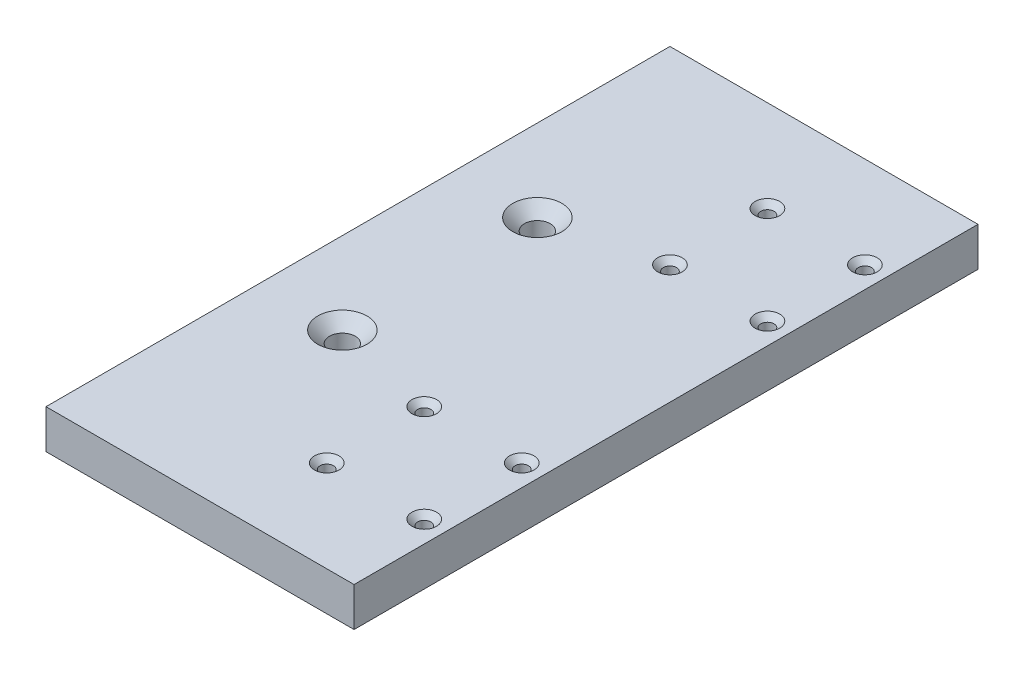
ISO-10303-21;
HEADER;
FILE_DESCRIPTION(('STEP AP214'),'2;1');
FILE_NAME('part.step','',(''),(''),'','','');
FILE_SCHEMA(('AUTOMOTIVE_DESIGN { 1 0 10303 214 1 1 1 1 }'));
ENDSEC;
DATA;
#1=APPLICATION_CONTEXT('core data for automotive mechanical design processes');
#2=APPLICATION_PROTOCOL_DEFINITION('international standard','automotive_design',2000,#1);
#3=PRODUCT_CONTEXT('',#1,'mechanical');
#4=PRODUCT('Part','Part','',(#3));
#5=PRODUCT_RELATED_PRODUCT_CATEGORY('part','',(#4));
#6=PRODUCT_DEFINITION_FORMATION('','',#4);
#7=PRODUCT_DEFINITION_CONTEXT('part definition',#1,'design');
#8=PRODUCT_DEFINITION('design','',#6,#7);
#9=PRODUCT_DEFINITION_SHAPE('','',#8);
#10=(LENGTH_UNIT() NAMED_UNIT(*) SI_UNIT(.MILLI.,.METRE.));
#11=(NAMED_UNIT(*) PLANE_ANGLE_UNIT() SI_UNIT($,.RADIAN.));
#12=(NAMED_UNIT(*) SI_UNIT($,.STERADIAN.) SOLID_ANGLE_UNIT());
#13=UNCERTAINTY_MEASURE_WITH_UNIT(LENGTH_MEASURE(1.E-05),#10,'distance_accuracy_value','');
#14=(GEOMETRIC_REPRESENTATION_CONTEXT(3) GLOBAL_UNCERTAINTY_ASSIGNED_CONTEXT((#13)) GLOBAL_UNIT_ASSIGNED_CONTEXT((#10,
#11,#12)) REPRESENTATION_CONTEXT('',''));
#15=CARTESIAN_POINT('',(0.,0.,0.));
#16=DIRECTION('',(0.,0.,1.));
#17=DIRECTION('',(1.,0.,0.));
#18=AXIS2_PLACEMENT_3D('',#15,#16,#17);
#19=CARTESIAN_POINT('',(39.5,10.,-80.));
#20=DIRECTION('',(-1.,0.,0.));
#21=DIRECTION('',(0.,0.,1.));
#22=AXIS2_PLACEMENT_3D('',#19,#20,#21);
#23=PLANE('',#22);
#24=DIRECTION('',(0.,0.,-1.));
#25=VECTOR('',#24,1.);
#26=CARTESIAN_POINT('',(39.5,0.,-80.));
#27=LINE('',#26,#25);
#28=CARTESIAN_POINT('',(39.5,0.,80.));
#29=VERTEX_POINT('',#28);
#30=CARTESIAN_POINT('',(39.5,0.,-80.));
#31=VERTEX_POINT('',#30);
#32=EDGE_CURVE('E249',#29,#31,#27,.T.);
#33=ORIENTED_EDGE('',*,*,#32,.T.);
#34=DIRECTION('',(0.,-1.,0.));
#35=VECTOR('',#34,1.);
#36=CARTESIAN_POINT('',(39.5,10.,-80.));
#37=LINE('',#36,#35);
#38=CARTESIAN_POINT('',(39.5,10.,-80.));
#39=VERTEX_POINT('',#38);
#40=EDGE_CURVE('E11',#39,#31,#37,.T.);
#41=ORIENTED_EDGE('',*,*,#40,.F.);
#42=DIRECTION('',(0.,0.,-1.));
#43=VECTOR('',#42,1.);
#44=CARTESIAN_POINT('',(39.5,10.,-80.));
#45=LINE('',#44,#43);
#46=CARTESIAN_POINT('',(39.5,10.,80.));
#47=VERTEX_POINT('',#46);
#48=EDGE_CURVE('E250',#47,#39,#45,.T.);
#49=ORIENTED_EDGE('',*,*,#48,.F.);
#50=DIRECTION('',(0.,-1.,0.));
#51=VECTOR('',#50,1.);
#52=CARTESIAN_POINT('',(39.5,10.,80.));
#53=LINE('',#52,#51);
#54=EDGE_CURVE('E260',#47,#29,#53,.T.);
#55=ORIENTED_EDGE('',*,*,#54,.T.);
#56=EDGE_LOOP('',(#33,#41,#49,#55));
#57=FACE_BOUND('',#56,.T.);
#58=ADVANCED_FACE('F43',(#57),#23,.F.);
#59=CARTESIAN_POINT('',(-39.5,10.,-80.));
#60=DIRECTION('',(0.,0.,1.));
#61=DIRECTION('',(1.,0.,0.));
#62=AXIS2_PLACEMENT_3D('',#59,#60,#61);
#63=PLANE('',#62);
#64=DIRECTION('',(-1.,0.,0.));
#65=VECTOR('',#64,1.);
#66=CARTESIAN_POINT('',(-39.5,0.,-80.));
#67=LINE('',#66,#65);
#68=CARTESIAN_POINT('',(-39.5,0.,-80.));
#69=VERTEX_POINT('',#68);
#70=EDGE_CURVE('E264',#31,#69,#67,.T.);
#71=ORIENTED_EDGE('',*,*,#70,.T.);
#72=DIRECTION('',(0.,-1.,0.));
#73=VECTOR('',#72,1.);
#74=CARTESIAN_POINT('',(-39.5,10.,-80.));
#75=LINE('',#74,#73);
#76=CARTESIAN_POINT('',(-39.5,10.,-80.));
#77=VERTEX_POINT('',#76);
#78=EDGE_CURVE('E52',#77,#69,#75,.T.);
#79=ORIENTED_EDGE('',*,*,#78,.F.);
#80=DIRECTION('',(-1.,0.,0.));
#81=VECTOR('',#80,1.);
#82=CARTESIAN_POINT('',(-39.5,10.,-80.));
#83=LINE('',#82,#81);
#84=EDGE_CURVE('E91',#39,#77,#83,.T.);
#85=ORIENTED_EDGE('',*,*,#84,.F.);
#86=ORIENTED_EDGE('',*,*,#40,.T.);
#87=EDGE_LOOP('',(#71,#79,#85,#86));
#88=FACE_BOUND('',#87,.T.);
#89=ADVANCED_FACE('F294',(#88),#63,.F.);
#90=CARTESIAN_POINT('',(-39.5,10.,-80.));
#91=DIRECTION('',(1.,0.,0.));
#92=DIRECTION('',(0.,0.,-1.));
#93=AXIS2_PLACEMENT_3D('',#90,#91,#92);
#94=PLANE('',#93);
#95=CARTESIAN_POINT('',(-39.5,5.,-40.));
#96=DIRECTION('',(-1.,0.,0.));
#97=DIRECTION('',(0.,0.,1.));
#98=AXIS2_PLACEMENT_3D('',#95,#96,#97);
#99=CIRCLE('',#98,3.025);
#100=CARTESIAN_POINT('',(-39.5,5.,-36.975));
#101=VERTEX_POINT('',#100);
#102=EDGE_CURVE('E118',#101,#101,#99,.T.);
#103=ORIENTED_EDGE('',*,*,#102,.F.);
#104=EDGE_LOOP('',(#103));
#105=FACE_BOUND('',#104,.T.);
#106=CARTESIAN_POINT('',(-39.5,5.,40.));
#107=DIRECTION('',(-1.,0.,0.));
#108=DIRECTION('',(0.,0.,1.));
#109=AXIS2_PLACEMENT_3D('',#106,#107,#108);
#110=CIRCLE('',#109,3.025);
#111=CARTESIAN_POINT('',(-39.5,5.,43.025));
#112=VERTEX_POINT('',#111);
#113=EDGE_CURVE('E109',#112,#112,#110,.T.);
#114=ORIENTED_EDGE('',*,*,#113,.F.);
#115=EDGE_LOOP('',(#114));
#116=FACE_BOUND('',#115,.T.);
#117=DIRECTION('',(0.,0.,1.));
#118=VECTOR('',#117,1.);
#119=CARTESIAN_POINT('',(-39.5,0.,-80.));
#120=LINE('',#119,#118);
#121=CARTESIAN_POINT('',(-39.5,0.,80.));
#122=VERTEX_POINT('',#121);
#123=EDGE_CURVE('E78',#69,#122,#120,.T.);
#124=ORIENTED_EDGE('',*,*,#123,.T.);
#125=DIRECTION('',(0.,-1.,0.));
#126=VECTOR('',#125,1.);
#127=CARTESIAN_POINT('',(-39.5,10.,80.));
#128=LINE('',#127,#126);
#129=CARTESIAN_POINT('',(-39.5,10.,80.));
#130=VERTEX_POINT('',#129);
#131=EDGE_CURVE('E273',#130,#122,#128,.T.);
#132=ORIENTED_EDGE('',*,*,#131,.F.);
#133=DIRECTION('',(0.,0.,1.));
#134=VECTOR('',#133,1.);
#135=CARTESIAN_POINT('',(-39.5,10.,-80.));
#136=LINE('',#135,#134);
#137=EDGE_CURVE('E255',#77,#130,#136,.T.);
#138=ORIENTED_EDGE('',*,*,#137,.F.);
#139=ORIENTED_EDGE('',*,*,#78,.T.);
#140=EDGE_LOOP('',(#124,#132,#138,#139));
#141=FACE_BOUND('',#140,.T.);
#142=ADVANCED_FACE('F277',(#105,#116,#141),#94,.F.);
#143=CARTESIAN_POINT('',(-39.5,10.,80.));
#144=DIRECTION('',(0.,0.,-1.));
#145=DIRECTION('',(-1.,0.,0.));
#146=AXIS2_PLACEMENT_3D('',#143,#144,#145);
#147=PLANE('',#146);
#148=DIRECTION('',(1.,0.,0.));
#149=VECTOR('',#148,1.);
#150=CARTESIAN_POINT('',(-39.5,0.,80.));
#151=LINE('',#150,#149);
#152=EDGE_CURVE('E84',#122,#29,#151,.T.);
#153=ORIENTED_EDGE('',*,*,#152,.T.);
#154=ORIENTED_EDGE('',*,*,#54,.F.);
#155=DIRECTION('',(1.,0.,0.));
#156=VECTOR('',#155,1.);
#157=CARTESIAN_POINT('',(-39.5,10.,80.));
#158=LINE('',#157,#156);
#159=EDGE_CURVE('E60',#130,#47,#158,.T.);
#160=ORIENTED_EDGE('',*,*,#159,.F.);
#161=ORIENTED_EDGE('',*,*,#131,.T.);
#162=EDGE_LOOP('',(#153,#154,#160,#161));
#163=FACE_BOUND('',#162,.T.);
#164=ADVANCED_FACE('F284',(#163),#147,.F.);
#165=CARTESIAN_POINT('',(0.,10.,0.));
#166=DIRECTION('',(0.,1.,0.));
#167=DIRECTION('',(0.,0.,1.));
#168=AXIS2_PLACEMENT_3D('',#165,#166,#167);
#169=PLANE('',#168);
#170=CARTESIAN_POINT('',(-18.5,10.,-25.));
#171=DIRECTION('',(0.,1.,0.));
#172=DIRECTION('',(0.,0.,1.));
#173=AXIS2_PLACEMENT_3D('',#170,#171,#172);
#174=CIRCLE('',#173,6.3);
#175=CARTESIAN_POINT('',(-18.5,10.,-18.7));
#176=VERTEX_POINT('',#175);
#177=EDGE_CURVE('E129',#176,#176,#174,.T.);
#178=ORIENTED_EDGE('',*,*,#177,.F.);
#179=EDGE_LOOP('',(#178));
#180=FACE_BOUND('',#179,.T.);
#181=CARTESIAN_POINT('',(-18.5,10.,25.));
#182=DIRECTION('',(0.,1.,0.));
#183=DIRECTION('',(0.,0.,1.));
#184=AXIS2_PLACEMENT_3D('',#181,#182,#183);
#185=CIRCLE('',#184,6.3);
#186=CARTESIAN_POINT('',(-18.5,10.,31.3));
#187=VERTEX_POINT('',#186);
#188=EDGE_CURVE('E141',#187,#187,#185,.T.);
#189=ORIENTED_EDGE('',*,*,#188,.F.);
#190=EDGE_LOOP('',(#189));
#191=FACE_BOUND('',#190,.T.);
#192=CARTESIAN_POINT('',(9.00000000000001,10.,56.5));
#193=DIRECTION('',(0.,1.,0.));
#194=DIRECTION('',(0.,0.,1.));
#195=AXIS2_PLACEMENT_3D('',#192,#193,#194);
#196=CIRCLE('',#195,3.15);
#197=CARTESIAN_POINT('',(9.00000000000001,10.,59.65));
#198=VERTEX_POINT('',#197);
#199=EDGE_CURVE('E153',#198,#198,#196,.T.);
#200=ORIENTED_EDGE('',*,*,#199,.F.);
#201=EDGE_LOOP('',(#200));
#202=FACE_BOUND('',#201,.T.);
#203=CARTESIAN_POINT('',(34.,10.,56.5));
#204=DIRECTION('',(0.,1.,0.));
#205=DIRECTION('',(0.,0.,1.));
#206=AXIS2_PLACEMENT_3D('',#203,#204,#205);
#207=CIRCLE('',#206,3.15);
#208=CARTESIAN_POINT('',(34.,10.,59.65));
#209=VERTEX_POINT('',#208);
#210=EDGE_CURVE('E165',#209,#209,#207,.T.);
#211=ORIENTED_EDGE('',*,*,#210,.F.);
#212=EDGE_LOOP('',(#211));
#213=FACE_BOUND('',#212,.T.);
#214=CARTESIAN_POINT('',(34.,10.,31.5));
#215=DIRECTION('',(0.,1.,0.));
#216=DIRECTION('',(0.,0.,1.));
#217=AXIS2_PLACEMENT_3D('',#214,#215,#216);
#218=CIRCLE('',#217,3.15);
#219=CARTESIAN_POINT('',(34.,10.,34.65));
#220=VERTEX_POINT('',#219);
#221=EDGE_CURVE('E177',#220,#220,#218,.T.);
#222=ORIENTED_EDGE('',*,*,#221,.F.);
#223=EDGE_LOOP('',(#222));
#224=FACE_BOUND('',#223,.T.);
#225=CARTESIAN_POINT('',(9.00000000000001,10.,31.5));
#226=DIRECTION('',(0.,1.,0.));
#227=DIRECTION('',(0.,0.,1.));
#228=AXIS2_PLACEMENT_3D('',#225,#226,#227);
#229=CIRCLE('',#228,3.15);
#230=CARTESIAN_POINT('',(9.00000000000001,10.,34.65));
#231=VERTEX_POINT('',#230);
#232=EDGE_CURVE('E189',#231,#231,#229,.T.);
#233=ORIENTED_EDGE('',*,*,#232,.F.);
#234=EDGE_LOOP('',(#233));
#235=FACE_BOUND('',#234,.T.);
#236=CARTESIAN_POINT('',(9.00000000000001,10.,-31.5));
#237=DIRECTION('',(0.,1.,0.));
#238=DIRECTION('',(0.,0.,1.));
#239=AXIS2_PLACEMENT_3D('',#236,#237,#238);
#240=CIRCLE('',#239,3.15);
#241=CARTESIAN_POINT('',(9.00000000000001,10.,-28.35));
#242=VERTEX_POINT('',#241);
#243=EDGE_CURVE('E201',#242,#242,#240,.T.);
#244=ORIENTED_EDGE('',*,*,#243,.F.);
#245=EDGE_LOOP('',(#244));
#246=FACE_BOUND('',#245,.T.);
#247=CARTESIAN_POINT('',(34.,10.,-31.5));
#248=DIRECTION('',(0.,1.,0.));
#249=DIRECTION('',(0.,0.,1.));
#250=AXIS2_PLACEMENT_3D('',#247,#248,#249);
#251=CIRCLE('',#250,3.15);
#252=CARTESIAN_POINT('',(34.,10.,-28.35));
#253=VERTEX_POINT('',#252);
#254=EDGE_CURVE('E213',#253,#253,#251,.T.);
#255=ORIENTED_EDGE('',*,*,#254,.F.);
#256=EDGE_LOOP('',(#255));
#257=FACE_BOUND('',#256,.T.);
#258=CARTESIAN_POINT('',(34.,10.,-56.5));
#259=DIRECTION('',(0.,1.,0.));
#260=DIRECTION('',(0.,0.,1.));
#261=AXIS2_PLACEMENT_3D('',#258,#259,#260);
#262=CIRCLE('',#261,3.15);
#263=CARTESIAN_POINT('',(34.,10.,-53.35));
#264=VERTEX_POINT('',#263);
#265=EDGE_CURVE('E225',#264,#264,#262,.T.);
#266=ORIENTED_EDGE('',*,*,#265,.F.);
#267=EDGE_LOOP('',(#266));
#268=FACE_BOUND('',#267,.T.);
#269=CARTESIAN_POINT('',(9.00000000000001,10.,-56.5));
#270=DIRECTION('',(0.,1.,0.));
#271=DIRECTION('',(0.,0.,1.));
#272=AXIS2_PLACEMENT_3D('',#269,#270,#271);
#273=CIRCLE('',#272,3.15);
#274=CARTESIAN_POINT('',(9.00000000000001,10.,-53.35));
#275=VERTEX_POINT('',#274);
#276=EDGE_CURVE('E237',#275,#275,#273,.T.);
#277=ORIENTED_EDGE('',*,*,#276,.F.);
#278=EDGE_LOOP('',(#277));
#279=FACE_BOUND('',#278,.T.);
#280=ORIENTED_EDGE('',*,*,#48,.T.);
#281=ORIENTED_EDGE('',*,*,#84,.T.);
#282=ORIENTED_EDGE('',*,*,#137,.T.);
#283=ORIENTED_EDGE('',*,*,#159,.T.);
#284=EDGE_LOOP('',(#280,#281,#282,#283));
#285=FACE_BOUND('',#284,.T.);
#286=ADVANCED_FACE('F286',(#180,#191,#202,#213,#224,#235,#246,#257,#268,#279,#285),#169,.T.);
#287=CARTESIAN_POINT('',(0.,0.,0.));
#288=DIRECTION('',(0.,1.,0.));
#289=DIRECTION('',(0.,0.,1.));
#290=AXIS2_PLACEMENT_3D('',#287,#288,#289);
#291=PLANE('',#290);
#292=CARTESIAN_POINT('',(-18.5,0.,-25.));
#293=DIRECTION('',(0.,1.,0.));
#294=DIRECTION('',(0.,0.,1.));
#295=AXIS2_PLACEMENT_3D('',#292,#293,#294);
#296=CIRCLE('',#295,3.3);
#297=CARTESIAN_POINT('',(-18.5,0.,-21.7));
#298=VERTEX_POINT('',#297);
#299=EDGE_CURVE('E137',#298,#298,#296,.T.);
#300=ORIENTED_EDGE('',*,*,#299,.T.);
#301=EDGE_LOOP('',(#300));
#302=FACE_BOUND('',#301,.T.);
#303=CARTESIAN_POINT('',(-18.5,0.,25.));
#304=DIRECTION('',(0.,1.,0.));
#305=DIRECTION('',(0.,0.,1.));
#306=AXIS2_PLACEMENT_3D('',#303,#304,#305);
#307=CIRCLE('',#306,3.3);
#308=CARTESIAN_POINT('',(-18.5,0.,28.3));
#309=VERTEX_POINT('',#308);
#310=EDGE_CURVE('E149',#309,#309,#307,.T.);
#311=ORIENTED_EDGE('',*,*,#310,.T.);
#312=EDGE_LOOP('',(#311));
#313=FACE_BOUND('',#312,.T.);
#314=CARTESIAN_POINT('',(9.00000000000001,0.,56.5));
#315=DIRECTION('',(0.,1.,0.));
#316=DIRECTION('',(0.,0.,1.));
#317=AXIS2_PLACEMENT_3D('',#314,#315,#316);
#318=CIRCLE('',#317,1.7);
#319=CARTESIAN_POINT('',(9.00000000000001,0.,58.2));
#320=VERTEX_POINT('',#319);
#321=EDGE_CURVE('E161',#320,#320,#318,.T.);
#322=ORIENTED_EDGE('',*,*,#321,.T.);
#323=EDGE_LOOP('',(#322));
#324=FACE_BOUND('',#323,.T.);
#325=CARTESIAN_POINT('',(34.,0.,56.5));
#326=DIRECTION('',(0.,1.,0.));
#327=DIRECTION('',(0.,0.,1.));
#328=AXIS2_PLACEMENT_3D('',#325,#326,#327);
#329=CIRCLE('',#328,1.7);
#330=CARTESIAN_POINT('',(34.,0.,58.2));
#331=VERTEX_POINT('',#330);
#332=EDGE_CURVE('E173',#331,#331,#329,.T.);
#333=ORIENTED_EDGE('',*,*,#332,.T.);
#334=EDGE_LOOP('',(#333));
#335=FACE_BOUND('',#334,.T.);
#336=CARTESIAN_POINT('',(34.,0.,31.5));
#337=DIRECTION('',(0.,1.,0.));
#338=DIRECTION('',(0.,0.,1.));
#339=AXIS2_PLACEMENT_3D('',#336,#337,#338);
#340=CIRCLE('',#339,1.7);
#341=CARTESIAN_POINT('',(34.,0.,33.2));
#342=VERTEX_POINT('',#341);
#343=EDGE_CURVE('E185',#342,#342,#340,.T.);
#344=ORIENTED_EDGE('',*,*,#343,.T.);
#345=EDGE_LOOP('',(#344));
#346=FACE_BOUND('',#345,.T.);
#347=CARTESIAN_POINT('',(9.00000000000001,0.,31.5));
#348=DIRECTION('',(0.,1.,0.));
#349=DIRECTION('',(0.,0.,1.));
#350=AXIS2_PLACEMENT_3D('',#347,#348,#349);
#351=CIRCLE('',#350,1.7);
#352=CARTESIAN_POINT('',(9.00000000000001,0.,33.2));
#353=VERTEX_POINT('',#352);
#354=EDGE_CURVE('E197',#353,#353,#351,.T.);
#355=ORIENTED_EDGE('',*,*,#354,.T.);
#356=EDGE_LOOP('',(#355));
#357=FACE_BOUND('',#356,.T.);
#358=CARTESIAN_POINT('',(9.00000000000001,0.,-31.5));
#359=DIRECTION('',(0.,1.,0.));
#360=DIRECTION('',(0.,0.,1.));
#361=AXIS2_PLACEMENT_3D('',#358,#359,#360);
#362=CIRCLE('',#361,1.7);
#363=CARTESIAN_POINT('',(9.00000000000001,0.,-29.8));
#364=VERTEX_POINT('',#363);
#365=EDGE_CURVE('E209',#364,#364,#362,.T.);
#366=ORIENTED_EDGE('',*,*,#365,.T.);
#367=EDGE_LOOP('',(#366));
#368=FACE_BOUND('',#367,.T.);
#369=CARTESIAN_POINT('',(34.,0.,-31.5));
#370=DIRECTION('',(0.,1.,0.));
#371=DIRECTION('',(0.,0.,1.));
#372=AXIS2_PLACEMENT_3D('',#369,#370,#371);
#373=CIRCLE('',#372,1.7);
#374=CARTESIAN_POINT('',(34.,0.,-29.8));
#375=VERTEX_POINT('',#374);
#376=EDGE_CURVE('E221',#375,#375,#373,.T.);
#377=ORIENTED_EDGE('',*,*,#376,.T.);
#378=EDGE_LOOP('',(#377));
#379=FACE_BOUND('',#378,.T.);
#380=CARTESIAN_POINT('',(34.,0.,-56.5));
#381=DIRECTION('',(0.,1.,0.));
#382=DIRECTION('',(0.,0.,1.));
#383=AXIS2_PLACEMENT_3D('',#380,#381,#382);
#384=CIRCLE('',#383,1.7);
#385=CARTESIAN_POINT('',(34.,0.,-54.8));
#386=VERTEX_POINT('',#385);
#387=EDGE_CURVE('E233',#386,#386,#384,.T.);
#388=ORIENTED_EDGE('',*,*,#387,.T.);
#389=EDGE_LOOP('',(#388));
#390=FACE_BOUND('',#389,.T.);
#391=CARTESIAN_POINT('',(9.00000000000001,0.,-56.5));
#392=DIRECTION('',(0.,1.,0.));
#393=DIRECTION('',(0.,0.,1.));
#394=AXIS2_PLACEMENT_3D('',#391,#392,#393);
#395=CIRCLE('',#394,1.7);
#396=CARTESIAN_POINT('',(9.00000000000001,0.,-54.8));
#397=VERTEX_POINT('',#396);
#398=EDGE_CURVE('E245',#397,#397,#395,.T.);
#399=ORIENTED_EDGE('',*,*,#398,.T.);
#400=EDGE_LOOP('',(#399));
#401=FACE_BOUND('',#400,.T.);
#402=ORIENTED_EDGE('',*,*,#32,.F.);
#403=ORIENTED_EDGE('',*,*,#152,.F.);
#404=ORIENTED_EDGE('',*,*,#123,.F.);
#405=ORIENTED_EDGE('',*,*,#70,.F.);
#406=EDGE_LOOP('',(#402,#403,#404,#405));
#407=FACE_BOUND('',#406,.T.);
#408=ADVANCED_FACE('F280',(#302,#313,#324,#335,#346,#357,#368,#379,#390,#401,#407),#291,.F.);
#409=CARTESIAN_POINT('',(9.00000000000001,10.,-56.5));
#410=DIRECTION('',(0.,1.,0.));
#411=DIRECTION('',(0.,0.,1.));
#412=AXIS2_PLACEMENT_3D('',#409,#410,#411);
#413=CYLINDRICAL_SURFACE('',#412,1.7);
#414=ORIENTED_EDGE('',*,*,#398,.F.);
#415=EDGE_LOOP('',(#414));
#416=FACE_BOUND('',#415,.T.);
#417=CARTESIAN_POINT('',(9.00000000000001,8.55,-56.5));
#418=DIRECTION('',(0.,1.,0.));
#419=DIRECTION('',(0.,0.,1.));
#420=AXIS2_PLACEMENT_3D('',#417,#418,#419);
#421=CIRCLE('',#420,1.7);
#422=CARTESIAN_POINT('',(9.00000000000001,8.55,-54.8));
#423=VERTEX_POINT('',#422);
#424=EDGE_CURVE('E241',#423,#423,#421,.T.);
#425=ORIENTED_EDGE('',*,*,#424,.T.);
#426=EDGE_LOOP('',(#425));
#427=FACE_BOUND('',#426,.T.);
#428=ADVANCED_FACE('F456',(#416,#427),#413,.F.);
#429=CARTESIAN_POINT('',(9.00000000000001,10.,-56.5));
#430=DIRECTION('',(0.,1.,0.));
#431=DIRECTION('',(0.,0.,1.));
#432=AXIS2_PLACEMENT_3D('',#429,#430,#431);
#433=CONICAL_SURFACE('',#432,3.15,0.785398163397448);
#434=ORIENTED_EDGE('',*,*,#424,.F.);
#435=EDGE_LOOP('',(#434));
#436=FACE_BOUND('',#435,.T.);
#437=ORIENTED_EDGE('',*,*,#276,.T.);
#438=EDGE_LOOP('',(#437));
#439=FACE_BOUND('',#438,.T.);
#440=ADVANCED_FACE('F452',(#436,#439),#433,.F.);
#441=CARTESIAN_POINT('',(34.,10.,-56.5));
#442=DIRECTION('',(0.,1.,0.));
#443=DIRECTION('',(0.,0.,1.));
#444=AXIS2_PLACEMENT_3D('',#441,#442,#443);
#445=CYLINDRICAL_SURFACE('',#444,1.7);
#446=ORIENTED_EDGE('',*,*,#387,.F.);
#447=EDGE_LOOP('',(#446));
#448=FACE_BOUND('',#447,.T.);
#449=CARTESIAN_POINT('',(34.,8.55,-56.5));
#450=DIRECTION('',(0.,1.,0.));
#451=DIRECTION('',(0.,0.,1.));
#452=AXIS2_PLACEMENT_3D('',#449,#450,#451);
#453=CIRCLE('',#452,1.7);
#454=CARTESIAN_POINT('',(34.,8.55,-54.8));
#455=VERTEX_POINT('',#454);
#456=EDGE_CURVE('E229',#455,#455,#453,.T.);
#457=ORIENTED_EDGE('',*,*,#456,.T.);
#458=EDGE_LOOP('',(#457));
#459=FACE_BOUND('',#458,.T.);
#460=ADVANCED_FACE('F448',(#448,#459),#445,.F.);
#461=CARTESIAN_POINT('',(34.,10.,-56.5));
#462=DIRECTION('',(0.,1.,0.));
#463=DIRECTION('',(0.,0.,1.));
#464=AXIS2_PLACEMENT_3D('',#461,#462,#463);
#465=CONICAL_SURFACE('',#464,3.15,0.785398163397447);
#466=ORIENTED_EDGE('',*,*,#456,.F.);
#467=EDGE_LOOP('',(#466));
#468=FACE_BOUND('',#467,.T.);
#469=ORIENTED_EDGE('',*,*,#265,.T.);
#470=EDGE_LOOP('',(#469));
#471=FACE_BOUND('',#470,.T.);
#472=ADVANCED_FACE('F444',(#468,#471),#465,.F.);
#473=CARTESIAN_POINT('',(34.,10.,-31.5));
#474=DIRECTION('',(0.,1.,0.));
#475=DIRECTION('',(0.,0.,1.));
#476=AXIS2_PLACEMENT_3D('',#473,#474,#475);
#477=CYLINDRICAL_SURFACE('',#476,1.7);
#478=ORIENTED_EDGE('',*,*,#376,.F.);
#479=EDGE_LOOP('',(#478));
#480=FACE_BOUND('',#479,.T.);
#481=CARTESIAN_POINT('',(34.,8.55,-31.5));
#482=DIRECTION('',(0.,1.,0.));
#483=DIRECTION('',(0.,0.,1.));
#484=AXIS2_PLACEMENT_3D('',#481,#482,#483);
#485=CIRCLE('',#484,1.7);
#486=CARTESIAN_POINT('',(34.,8.55,-29.8));
#487=VERTEX_POINT('',#486);
#488=EDGE_CURVE('E217',#487,#487,#485,.T.);
#489=ORIENTED_EDGE('',*,*,#488,.T.);
#490=EDGE_LOOP('',(#489));
#491=FACE_BOUND('',#490,.T.);
#492=ADVANCED_FACE('F440',(#480,#491),#477,.F.);
#493=CARTESIAN_POINT('',(34.,10.,-31.5));
#494=DIRECTION('',(0.,1.,0.));
#495=DIRECTION('',(0.,0.,1.));
#496=AXIS2_PLACEMENT_3D('',#493,#494,#495);
#497=CONICAL_SURFACE('',#496,3.15,0.785398163397447);
#498=ORIENTED_EDGE('',*,*,#488,.F.);
#499=EDGE_LOOP('',(#498));
#500=FACE_BOUND('',#499,.T.);
#501=ORIENTED_EDGE('',*,*,#254,.T.);
#502=EDGE_LOOP('',(#501));
#503=FACE_BOUND('',#502,.T.);
#504=ADVANCED_FACE('F436',(#500,#503),#497,.F.);
#505=CARTESIAN_POINT('',(9.00000000000001,10.,-31.5));
#506=DIRECTION('',(0.,1.,0.));
#507=DIRECTION('',(0.,0.,1.));
#508=AXIS2_PLACEMENT_3D('',#505,#506,#507);
#509=CYLINDRICAL_SURFACE('',#508,1.7);
#510=ORIENTED_EDGE('',*,*,#365,.F.);
#511=EDGE_LOOP('',(#510));
#512=FACE_BOUND('',#511,.T.);
#513=CARTESIAN_POINT('',(9.00000000000001,8.55,-31.5));
#514=DIRECTION('',(0.,1.,0.));
#515=DIRECTION('',(0.,0.,1.));
#516=AXIS2_PLACEMENT_3D('',#513,#514,#515);
#517=CIRCLE('',#516,1.7);
#518=CARTESIAN_POINT('',(9.00000000000001,8.55,-29.8));
#519=VERTEX_POINT('',#518);
#520=EDGE_CURVE('E205',#519,#519,#517,.T.);
#521=ORIENTED_EDGE('',*,*,#520,.T.);
#522=EDGE_LOOP('',(#521));
#523=FACE_BOUND('',#522,.T.);
#524=ADVANCED_FACE('F432',(#512,#523),#509,.F.);
#525=CARTESIAN_POINT('',(9.00000000000001,10.,-31.5));
#526=DIRECTION('',(0.,1.,0.));
#527=DIRECTION('',(0.,0.,1.));
#528=AXIS2_PLACEMENT_3D('',#525,#526,#527);
#529=CONICAL_SURFACE('',#528,3.15,0.785398163397448);
#530=ORIENTED_EDGE('',*,*,#520,.F.);
#531=EDGE_LOOP('',(#530));
#532=FACE_BOUND('',#531,.T.);
#533=ORIENTED_EDGE('',*,*,#243,.T.);
#534=EDGE_LOOP('',(#533));
#535=FACE_BOUND('',#534,.T.);
#536=ADVANCED_FACE('F428',(#532,#535),#529,.F.);
#537=CARTESIAN_POINT('',(9.00000000000001,10.,31.5));
#538=DIRECTION('',(0.,1.,0.));
#539=DIRECTION('',(0.,0.,1.));
#540=AXIS2_PLACEMENT_3D('',#537,#538,#539);
#541=CYLINDRICAL_SURFACE('',#540,1.7);
#542=ORIENTED_EDGE('',*,*,#354,.F.);
#543=EDGE_LOOP('',(#542));
#544=FACE_BOUND('',#543,.T.);
#545=CARTESIAN_POINT('',(9.00000000000001,8.55,31.5));
#546=DIRECTION('',(0.,1.,0.));
#547=DIRECTION('',(0.,0.,1.));
#548=AXIS2_PLACEMENT_3D('',#545,#546,#547);
#549=CIRCLE('',#548,1.7);
#550=CARTESIAN_POINT('',(9.00000000000001,8.55,33.2));
#551=VERTEX_POINT('',#550);
#552=EDGE_CURVE('E193',#551,#551,#549,.T.);
#553=ORIENTED_EDGE('',*,*,#552,.T.);
#554=EDGE_LOOP('',(#553));
#555=FACE_BOUND('',#554,.T.);
#556=ADVANCED_FACE('F424',(#544,#555),#541,.F.);
#557=CARTESIAN_POINT('',(9.00000000000001,10.,31.5));
#558=DIRECTION('',(0.,1.,0.));
#559=DIRECTION('',(0.,0.,1.));
#560=AXIS2_PLACEMENT_3D('',#557,#558,#559);
#561=CONICAL_SURFACE('',#560,3.15,0.785398163397448);
#562=ORIENTED_EDGE('',*,*,#552,.F.);
#563=EDGE_LOOP('',(#562));
#564=FACE_BOUND('',#563,.T.);
#565=ORIENTED_EDGE('',*,*,#232,.T.);
#566=EDGE_LOOP('',(#565));
#567=FACE_BOUND('',#566,.T.);
#568=ADVANCED_FACE('F420',(#564,#567),#561,.F.);
#569=CARTESIAN_POINT('',(34.,10.,31.5));
#570=DIRECTION('',(0.,1.,0.));
#571=DIRECTION('',(0.,0.,1.));
#572=AXIS2_PLACEMENT_3D('',#569,#570,#571);
#573=CYLINDRICAL_SURFACE('',#572,1.7);
#574=ORIENTED_EDGE('',*,*,#343,.F.);
#575=EDGE_LOOP('',(#574));
#576=FACE_BOUND('',#575,.T.);
#577=CARTESIAN_POINT('',(34.,8.55,31.5));
#578=DIRECTION('',(0.,1.,0.));
#579=DIRECTION('',(0.,0.,1.));
#580=AXIS2_PLACEMENT_3D('',#577,#578,#579);
#581=CIRCLE('',#580,1.7);
#582=CARTESIAN_POINT('',(34.,8.55,33.2));
#583=VERTEX_POINT('',#582);
#584=EDGE_CURVE('E181',#583,#583,#581,.T.);
#585=ORIENTED_EDGE('',*,*,#584,.T.);
#586=EDGE_LOOP('',(#585));
#587=FACE_BOUND('',#586,.T.);
#588=ADVANCED_FACE('F416',(#576,#587),#573,.F.);
#589=CARTESIAN_POINT('',(34.,10.,31.5));
#590=DIRECTION('',(0.,1.,0.));
#591=DIRECTION('',(0.,0.,1.));
#592=AXIS2_PLACEMENT_3D('',#589,#590,#591);
#593=CONICAL_SURFACE('',#592,3.15,0.785398163397447);
#594=ORIENTED_EDGE('',*,*,#584,.F.);
#595=EDGE_LOOP('',(#594));
#596=FACE_BOUND('',#595,.T.);
#597=ORIENTED_EDGE('',*,*,#221,.T.);
#598=EDGE_LOOP('',(#597));
#599=FACE_BOUND('',#598,.T.);
#600=ADVANCED_FACE('F412',(#596,#599),#593,.F.);
#601=CARTESIAN_POINT('',(34.,10.,56.5));
#602=DIRECTION('',(0.,1.,0.));
#603=DIRECTION('',(0.,0.,1.));
#604=AXIS2_PLACEMENT_3D('',#601,#602,#603);
#605=CYLINDRICAL_SURFACE('',#604,1.7);
#606=ORIENTED_EDGE('',*,*,#332,.F.);
#607=EDGE_LOOP('',(#606));
#608=FACE_BOUND('',#607,.T.);
#609=CARTESIAN_POINT('',(34.,8.55,56.5));
#610=DIRECTION('',(0.,1.,0.));
#611=DIRECTION('',(0.,0.,1.));
#612=AXIS2_PLACEMENT_3D('',#609,#610,#611);
#613=CIRCLE('',#612,1.7);
#614=CARTESIAN_POINT('',(34.,8.55,58.2));
#615=VERTEX_POINT('',#614);
#616=EDGE_CURVE('E169',#615,#615,#613,.T.);
#617=ORIENTED_EDGE('',*,*,#616,.T.);
#618=EDGE_LOOP('',(#617));
#619=FACE_BOUND('',#618,.T.);
#620=ADVANCED_FACE('F408',(#608,#619),#605,.F.);
#621=CARTESIAN_POINT('',(34.,10.,56.5));
#622=DIRECTION('',(0.,1.,0.));
#623=DIRECTION('',(0.,0.,1.));
#624=AXIS2_PLACEMENT_3D('',#621,#622,#623);
#625=CONICAL_SURFACE('',#624,3.15,0.785398163397447);
#626=ORIENTED_EDGE('',*,*,#616,.F.);
#627=EDGE_LOOP('',(#626));
#628=FACE_BOUND('',#627,.T.);
#629=ORIENTED_EDGE('',*,*,#210,.T.);
#630=EDGE_LOOP('',(#629));
#631=FACE_BOUND('',#630,.T.);
#632=ADVANCED_FACE('F404',(#628,#631),#625,.F.);
#633=CARTESIAN_POINT('',(9.00000000000001,10.,56.5));
#634=DIRECTION('',(0.,1.,0.));
#635=DIRECTION('',(0.,0.,1.));
#636=AXIS2_PLACEMENT_3D('',#633,#634,#635);
#637=CYLINDRICAL_SURFACE('',#636,1.7);
#638=ORIENTED_EDGE('',*,*,#321,.F.);
#639=EDGE_LOOP('',(#638));
#640=FACE_BOUND('',#639,.T.);
#641=CARTESIAN_POINT('',(9.00000000000001,8.55,56.5));
#642=DIRECTION('',(0.,1.,0.));
#643=DIRECTION('',(0.,0.,1.));
#644=AXIS2_PLACEMENT_3D('',#641,#642,#643);
#645=CIRCLE('',#644,1.7);
#646=CARTESIAN_POINT('',(9.00000000000001,8.55,58.2));
#647=VERTEX_POINT('',#646);
#648=EDGE_CURVE('E157',#647,#647,#645,.T.);
#649=ORIENTED_EDGE('',*,*,#648,.T.);
#650=EDGE_LOOP('',(#649));
#651=FACE_BOUND('',#650,.T.);
#652=ADVANCED_FACE('F400',(#640,#651),#637,.F.);
#653=CARTESIAN_POINT('',(9.00000000000001,10.,56.5));
#654=DIRECTION('',(0.,1.,0.));
#655=DIRECTION('',(0.,0.,1.));
#656=AXIS2_PLACEMENT_3D('',#653,#654,#655);
#657=CONICAL_SURFACE('',#656,3.15,0.785398163397448);
#658=ORIENTED_EDGE('',*,*,#648,.F.);
#659=EDGE_LOOP('',(#658));
#660=FACE_BOUND('',#659,.T.);
#661=ORIENTED_EDGE('',*,*,#199,.T.);
#662=EDGE_LOOP('',(#661));
#663=FACE_BOUND('',#662,.T.);
#664=ADVANCED_FACE('F396',(#660,#663),#657,.F.);
#665=CARTESIAN_POINT('',(-18.5,10.,25.));
#666=DIRECTION('',(0.,1.,0.));
#667=DIRECTION('',(0.,0.,1.));
#668=AXIS2_PLACEMENT_3D('',#665,#666,#667);
#669=CYLINDRICAL_SURFACE('',#668,3.3);
#670=ORIENTED_EDGE('',*,*,#310,.F.);
#671=EDGE_LOOP('',(#670));
#672=FACE_BOUND('',#671,.T.);
#673=CARTESIAN_POINT('',(-18.5,7.,25.));
#674=DIRECTION('',(0.,1.,0.));
#675=DIRECTION('',(0.,0.,1.));
#676=AXIS2_PLACEMENT_3D('',#673,#674,#675);
#677=CIRCLE('',#676,3.3);
#678=CARTESIAN_POINT('',(-18.5,7.,28.3));
#679=VERTEX_POINT('',#678);
#680=EDGE_CURVE('E145',#679,#679,#677,.T.);
#681=ORIENTED_EDGE('',*,*,#680,.T.);
#682=EDGE_LOOP('',(#681));
#683=FACE_BOUND('',#682,.T.);
#684=ADVANCED_FACE('F392',(#672,#683),#669,.F.);
#685=CARTESIAN_POINT('',(-18.5,10.,25.));
#686=DIRECTION('',(0.,1.,0.));
#687=DIRECTION('',(0.,0.,1.));
#688=AXIS2_PLACEMENT_3D('',#685,#686,#687);
#689=CONICAL_SURFACE('',#688,6.3,0.785398163397449);
#690=ORIENTED_EDGE('',*,*,#680,.F.);
#691=EDGE_LOOP('',(#690));
#692=FACE_BOUND('',#691,.T.);
#693=ORIENTED_EDGE('',*,*,#188,.T.);
#694=EDGE_LOOP('',(#693));
#695=FACE_BOUND('',#694,.T.);
#696=ADVANCED_FACE('F388',(#692,#695),#689,.F.);
#697=CARTESIAN_POINT('',(-18.5,10.,-25.));
#698=DIRECTION('',(0.,1.,0.));
#699=DIRECTION('',(0.,0.,1.));
#700=AXIS2_PLACEMENT_3D('',#697,#698,#699);
#701=CYLINDRICAL_SURFACE('',#700,3.3);
#702=ORIENTED_EDGE('',*,*,#299,.F.);
#703=EDGE_LOOP('',(#702));
#704=FACE_BOUND('',#703,.T.);
#705=CARTESIAN_POINT('',(-18.5,7.,-25.));
#706=DIRECTION('',(0.,1.,0.));
#707=DIRECTION('',(0.,0.,1.));
#708=AXIS2_PLACEMENT_3D('',#705,#706,#707);
#709=CIRCLE('',#708,3.3);
#710=CARTESIAN_POINT('',(-18.5,7.,-21.7));
#711=VERTEX_POINT('',#710);
#712=EDGE_CURVE('E133',#711,#711,#709,.T.);
#713=ORIENTED_EDGE('',*,*,#712,.T.);
#714=EDGE_LOOP('',(#713));
#715=FACE_BOUND('',#714,.T.);
#716=ADVANCED_FACE('F384',(#704,#715),#701,.F.);
#717=CARTESIAN_POINT('',(-18.5,10.,-25.));
#718=DIRECTION('',(0.,1.,0.));
#719=DIRECTION('',(0.,0.,1.));
#720=AXIS2_PLACEMENT_3D('',#717,#718,#719);
#721=CONICAL_SURFACE('',#720,6.3,0.785398163397449);
#722=ORIENTED_EDGE('',*,*,#712,.F.);
#723=EDGE_LOOP('',(#722));
#724=FACE_BOUND('',#723,.T.);
#725=ORIENTED_EDGE('',*,*,#177,.T.);
#726=EDGE_LOOP('',(#725));
#727=FACE_BOUND('',#726,.T.);
#728=ADVANCED_FACE('F315',(#724,#727),#721,.F.);
#729=CARTESIAN_POINT('',(-4.49999999999999,5.,40.));
#730=DIRECTION('',(-1.,0.,0.));
#731=DIRECTION('',(0.,0.,1.));
#732=AXIS2_PLACEMENT_3D('',#729,#730,#731);
#733=CONICAL_SURFACE('',#732,2.49999999999999,1.02974425867665);
#734=CARTESIAN_POINT('',(-2.99784845243109,4.99999999999999,40.));
#735=VERTEX_POINT('',#734);
#736=VERTEX_LOOP('',#735);
#737=FACE_BOUND('',#736,.T.);
#738=CARTESIAN_POINT('',(-4.49999999999999,5.,40.));
#739=DIRECTION('',(-1.,0.,0.));
#740=DIRECTION('',(0.,0.,1.));
#741=AXIS2_PLACEMENT_3D('',#738,#739,#740);
#742=CIRCLE('',#741,2.49999999999999);
#743=CARTESIAN_POINT('',(-4.49999999999999,5.,42.5));
#744=VERTEX_POINT('',#743);
#745=EDGE_CURVE('E125',#744,#744,#742,.T.);
#746=ORIENTED_EDGE('',*,*,#745,.T.);
#747=EDGE_LOOP('',(#746));
#748=FACE_BOUND('',#747,.T.);
#749=ADVANCED_FACE('F320',(#737,#748),#733,.F.);
#750=CARTESIAN_POINT('',(-39.5,5.,40.));
#751=DIRECTION('',(-1.,0.,0.));
#752=DIRECTION('',(0.,0.,1.));
#753=AXIS2_PLACEMENT_3D('',#750,#751,#752);
#754=CYLINDRICAL_SURFACE('',#753,2.49999999999999);
#755=ORIENTED_EDGE('',*,*,#745,.F.);
#756=EDGE_LOOP('',(#755));
#757=FACE_BOUND('',#756,.T.);
#758=CARTESIAN_POINT('',(-38.975,5.,40.));
#759=DIRECTION('',(-1.,0.,0.));
#760=DIRECTION('',(0.,0.,1.));
#761=AXIS2_PLACEMENT_3D('',#758,#759,#760);
#762=CIRCLE('',#761,2.5);
#763=CARTESIAN_POINT('',(-38.975,5.,42.5));
#764=VERTEX_POINT('',#763);
#765=EDGE_CURVE('E115',#764,#764,#762,.T.);
#766=ORIENTED_EDGE('',*,*,#765,.T.);
#767=EDGE_LOOP('',(#766));
#768=FACE_BOUND('',#767,.T.);
#769=ADVANCED_FACE('F325',(#757,#768),#754,.F.);
#770=CARTESIAN_POINT('',(-39.5,5.,40.));
#771=DIRECTION('',(-1.,0.,0.));
#772=DIRECTION('',(0.,0.,1.));
#773=AXIS2_PLACEMENT_3D('',#770,#771,#772);
#774=CONICAL_SURFACE('',#773,3.025,0.785398163397448);
#775=ORIENTED_EDGE('',*,*,#765,.F.);
#776=EDGE_LOOP('',(#775));
#777=FACE_BOUND('',#776,.T.);
#778=ORIENTED_EDGE('',*,*,#113,.T.);
#779=EDGE_LOOP('',(#778));
#780=FACE_BOUND('',#779,.T.);
#781=ADVANCED_FACE('F102',(#777,#780),#774,.F.);
#782=CARTESIAN_POINT('',(-4.5,5.,-40.));
#783=DIRECTION('',(-1.,0.,0.));
#784=DIRECTION('',(0.,0.,1.));
#785=AXIS2_PLACEMENT_3D('',#782,#783,#784);
#786=CONICAL_SURFACE('',#785,2.49999999999999,1.02974425867665);
#787=CARTESIAN_POINT('',(-2.9978484524311,4.99999999999999,-40.));
#788=VERTEX_POINT('',#787);
#789=VERTEX_LOOP('',#788);
#790=FACE_BOUND('',#789,.T.);
#791=CARTESIAN_POINT('',(-4.5,5.,-40.));
#792=DIRECTION('',(-1.,0.,0.));
#793=DIRECTION('',(0.,0.,1.));
#794=AXIS2_PLACEMENT_3D('',#791,#792,#793);
#795=CIRCLE('',#794,2.49999999999999);
#796=CARTESIAN_POINT('',(-4.5,5.,-37.5));
#797=VERTEX_POINT('',#796);
#798=EDGE_CURVE('E106',#797,#797,#795,.T.);
#799=ORIENTED_EDGE('',*,*,#798,.T.);
#800=EDGE_LOOP('',(#799));
#801=FACE_BOUND('',#800,.T.);
#802=ADVANCED_FACE('F98',(#790,#801),#786,.F.);
#803=CARTESIAN_POINT('',(-39.5,5.,-40.));
#804=DIRECTION('',(-1.,0.,0.));
#805=DIRECTION('',(0.,0.,1.));
#806=AXIS2_PLACEMENT_3D('',#803,#804,#805);
#807=CYLINDRICAL_SURFACE('',#806,2.49999999999999);
#808=ORIENTED_EDGE('',*,*,#798,.F.);
#809=EDGE_LOOP('',(#808));
#810=FACE_BOUND('',#809,.T.);
#811=CARTESIAN_POINT('',(-38.975,5.,-40.));
#812=DIRECTION('',(-1.,0.,0.));
#813=DIRECTION('',(0.,0.,1.));
#814=AXIS2_PLACEMENT_3D('',#811,#812,#813);
#815=CIRCLE('',#814,2.5);
#816=CARTESIAN_POINT('',(-38.975,5.,-37.5));
#817=VERTEX_POINT('',#816);
#818=EDGE_CURVE('E110',#817,#817,#815,.T.);
#819=ORIENTED_EDGE('',*,*,#818,.T.);
#820=EDGE_LOOP('',(#819));
#821=FACE_BOUND('',#820,.T.);
#822=ADVANCED_FACE('F101',(#810,#821),#807,.F.);
#823=CARTESIAN_POINT('',(-39.5,5.,-40.));
#824=DIRECTION('',(-1.,0.,0.));
#825=DIRECTION('',(0.,0.,1.));
#826=AXIS2_PLACEMENT_3D('',#823,#824,#825);
#827=CONICAL_SURFACE('',#826,3.025,0.785398163397448);
#828=ORIENTED_EDGE('',*,*,#818,.F.);
#829=EDGE_LOOP('',(#828));
#830=FACE_BOUND('',#829,.T.);
#831=ORIENTED_EDGE('',*,*,#102,.T.);
#832=EDGE_LOOP('',(#831));
#833=FACE_BOUND('',#832,.T.);
#834=ADVANCED_FACE('F362',(#830,#833),#827,.F.);
#835=CLOSED_SHELL('',(#58,#89,#142,#164,#286,#408,#428,#440,#460,#472,#492,#504,#524,#536,#556,
#568,#588,#600,#620,#632,#652,#664,#684,#696,#716,#728,#749,#769,#781,#802,#822,#834));
#836=MANIFOLD_SOLID_BREP('B2',#835);
#837=ADVANCED_BREP_SHAPE_REPRESENTATION('',(#18,#836),#14);
#838=SHAPE_DEFINITION_REPRESENTATION(#9,#837);
ENDSEC;
END-ISO-10303-21;
